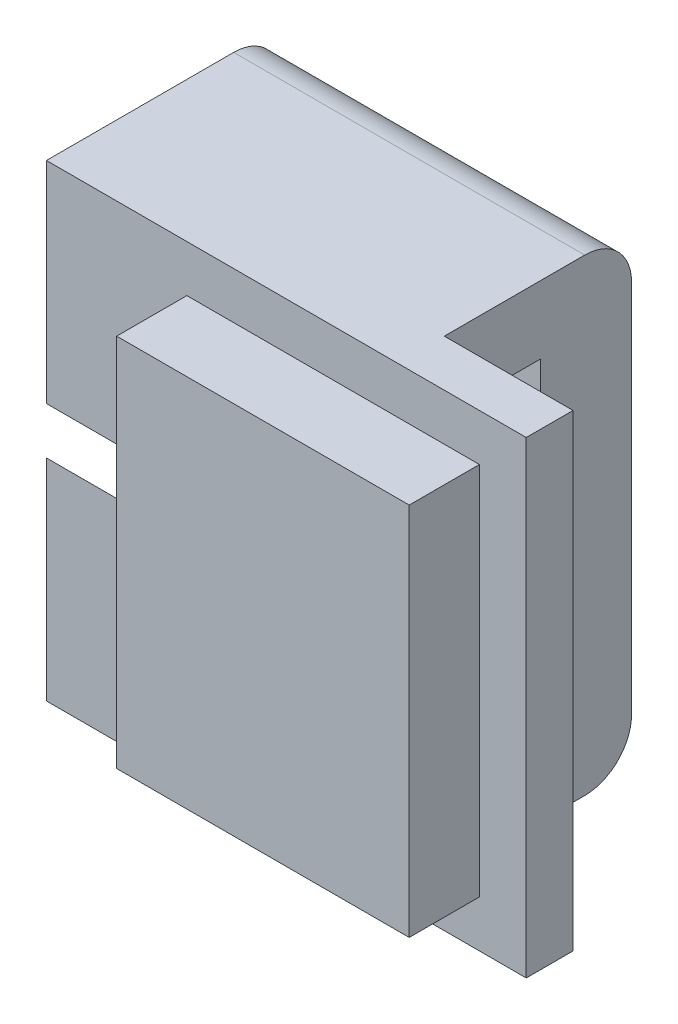
ISO-10303-21;
HEADER;
FILE_DESCRIPTION(('STEP AP214'),'2;1');
FILE_NAME('part.step','',(''),(''),'','','');
FILE_SCHEMA(('AUTOMOTIVE_DESIGN { 1 0 10303 214 1 1 1 1 }'));
ENDSEC;
DATA;
#1=APPLICATION_CONTEXT('core data for automotive mechanical design processes');
#2=APPLICATION_PROTOCOL_DEFINITION('international standard','automotive_design',2000,#1);
#3=PRODUCT_CONTEXT('',#1,'mechanical');
#4=PRODUCT('Part','Part','',(#3));
#5=PRODUCT_RELATED_PRODUCT_CATEGORY('part','',(#4));
#6=PRODUCT_DEFINITION_FORMATION('','',#4);
#7=PRODUCT_DEFINITION_CONTEXT('part definition',#1,'design');
#8=PRODUCT_DEFINITION('design','',#6,#7);
#9=PRODUCT_DEFINITION_SHAPE('','',#8);
#10=(LENGTH_UNIT() NAMED_UNIT(*) SI_UNIT(.MILLI.,.METRE.));
#11=(NAMED_UNIT(*) PLANE_ANGLE_UNIT() SI_UNIT($,.RADIAN.));
#12=(NAMED_UNIT(*) SI_UNIT($,.STERADIAN.) SOLID_ANGLE_UNIT());
#13=UNCERTAINTY_MEASURE_WITH_UNIT(LENGTH_MEASURE(1.E-05),#10,'distance_accuracy_value','');
#14=(GEOMETRIC_REPRESENTATION_CONTEXT(3) GLOBAL_UNCERTAINTY_ASSIGNED_CONTEXT((#13)) GLOBAL_UNIT_ASSIGNED_CONTEXT((#10,
#11,#12)) REPRESENTATION_CONTEXT('',''));
#15=CARTESIAN_POINT('',(0.,0.,0.));
#16=DIRECTION('',(0.,0.,1.));
#17=DIRECTION('',(1.,0.,0.));
#18=AXIS2_PLACEMENT_3D('',#15,#16,#17);
#19=CARTESIAN_POINT('',(20.5,-10.,5.));
#20=DIRECTION('',(0.,0.,-1.));
#21=DIRECTION('',(-1.,0.,0.));
#22=AXIS2_PLACEMENT_3D('',#19,#20,#21);
#23=PLANE('',#22);
#24=DIRECTION('',(-1.,0.,0.));
#25=VECTOR('',#24,1.);
#26=CARTESIAN_POINT('',(9.99999999999998,-1.00498756211208,5.));
#27=LINE('',#26,#25);
#28=CARTESIAN_POINT('',(0.,-1.00498756211208,5.));
#29=VERTEX_POINT('',#28);
#30=CARTESIAN_POINT('',(6.,-1.00498756211208,5.));
#31=VERTEX_POINT('',#30);
#32=EDGE_CURVE('E349',#29,#31,#27,.F.);
#33=ORIENTED_EDGE('',*,*,#32,.F.);
#34=DIRECTION('',(0.,-1.,0.));
#35=VECTOR('',#34,1.);
#36=CARTESIAN_POINT('',(0.,-10.,5.));
#37=LINE('',#36,#35);
#38=CARTESIAN_POINT('',(0.,-10.,5.));
#39=VERTEX_POINT('',#38);
#40=EDGE_CURVE('E403',#29,#39,#37,.T.);
#41=ORIENTED_EDGE('',*,*,#40,.T.);
#42=DIRECTION('',(-1.,0.,0.));
#43=VECTOR('',#42,1.);
#44=CARTESIAN_POINT('',(20.5,-10.,5.));
#45=LINE('',#44,#43);
#46=CARTESIAN_POINT('',(20.5,-10.,5.));
#47=VERTEX_POINT('',#46);
#48=EDGE_CURVE('E400',#47,#39,#45,.T.);
#49=ORIENTED_EDGE('',*,*,#48,.F.);
#50=DIRECTION('',(0.,-1.,0.));
#51=VECTOR('',#50,1.);
#52=CARTESIAN_POINT('',(20.5,-10.,5.));
#53=LINE('',#52,#51);
#54=CARTESIAN_POINT('',(20.5,10.,5.));
#55=VERTEX_POINT('',#54);
#56=EDGE_CURVE('E392',#55,#47,#53,.T.);
#57=ORIENTED_EDGE('',*,*,#56,.F.);
#58=DIRECTION('',(-1.,0.,0.));
#59=VECTOR('',#58,1.);
#60=CARTESIAN_POINT('',(20.5,10.,5.));
#61=LINE('',#60,#59);
#62=CARTESIAN_POINT('',(0.,10.,5.));
#63=VERTEX_POINT('',#62);
#64=EDGE_CURVE('E417',#55,#63,#61,.T.);
#65=ORIENTED_EDGE('',*,*,#64,.T.);
#66=CARTESIAN_POINT('',(0.,1.00498756211208,5.));
#67=VERTEX_POINT('',#66);
#68=EDGE_CURVE('E404',#63,#67,#37,.T.);
#69=ORIENTED_EDGE('',*,*,#68,.T.);
#70=DIRECTION('',(-1.,0.,0.));
#71=VECTOR('',#70,1.);
#72=CARTESIAN_POINT('',(9.99999999999998,1.00498756211208,5.));
#73=LINE('',#72,#71);
#74=CARTESIAN_POINT('',(6.,1.00498756211208,5.));
#75=VERTEX_POINT('',#74);
#76=EDGE_CURVE('E342',#75,#67,#73,.T.);
#77=ORIENTED_EDGE('',*,*,#76,.F.);
#78=DIRECTION('',(0.,-1.,0.));
#79=VECTOR('',#78,1.);
#80=CARTESIAN_POINT('',(6.,-10.,5.));
#81=LINE('',#80,#79);
#82=CARTESIAN_POINT('',(6.,8.,5.));
#83=VERTEX_POINT('',#82);
#84=EDGE_CURVE('E422',#83,#75,#81,.T.);
#85=ORIENTED_EDGE('',*,*,#84,.F.);
#86=DIRECTION('',(-1.,0.,0.));
#87=VECTOR('',#86,1.);
#88=CARTESIAN_POINT('',(20.5,8.00000000000001,5.));
#89=LINE('',#88,#87);
#90=CARTESIAN_POINT('',(18.5,8.00000000000001,5.));
#91=VERTEX_POINT('',#90);
#92=EDGE_CURVE('E426',#91,#83,#89,.T.);
#93=ORIENTED_EDGE('',*,*,#92,.F.);
#94=DIRECTION('',(0.,1.,0.));
#95=VECTOR('',#94,1.);
#96=CARTESIAN_POINT('',(18.5,-10.,5.));
#97=LINE('',#96,#95);
#98=CARTESIAN_POINT('',(18.5,-7.99999999999999,5.));
#99=VERTEX_POINT('',#98);
#100=EDGE_CURVE('E430',#99,#91,#97,.T.);
#101=ORIENTED_EDGE('',*,*,#100,.F.);
#102=DIRECTION('',(1.,0.,0.));
#103=VECTOR('',#102,1.);
#104=CARTESIAN_POINT('',(20.5,-7.99999999999999,5.));
#105=LINE('',#104,#103);
#106=CARTESIAN_POINT('',(6.,-8.,5.));
#107=VERTEX_POINT('',#106);
#108=EDGE_CURVE('E434',#107,#99,#105,.T.);
#109=ORIENTED_EDGE('',*,*,#108,.F.);
#110=EDGE_CURVE('E421',#31,#107,#81,.T.);
#111=ORIENTED_EDGE('',*,*,#110,.F.);
#112=EDGE_LOOP('',(#33,#41,#49,#57,#65,#69,#77,#85,#93,#101,#109,#111));
#113=FACE_BOUND('',#112,.T.);
#114=ADVANCED_FACE('F53',(#113),#23,.F.);
#115=CARTESIAN_POINT('',(20.5,-9.99999999999999,-5.));
#116=DIRECTION('',(0.,0.,1.));
#117=DIRECTION('',(1.,0.,0.));
#118=AXIS2_PLACEMENT_3D('',#115,#116,#117);
#119=PLANE('',#118);
#120=DIRECTION('',(0.,1.,0.));
#121=VECTOR('',#120,1.);
#122=CARTESIAN_POINT('',(0.,-9.99999999999999,-5.));
#123=LINE('',#122,#121);
#124=CARTESIAN_POINT('',(0.,1.00498756211209,-5.));
#125=VERTEX_POINT('',#124);
#126=CARTESIAN_POINT('',(0.,8.,-5.));
#127=VERTEX_POINT('',#126);
#128=EDGE_CURVE('E411',#125,#127,#123,.T.);
#129=ORIENTED_EDGE('',*,*,#128,.T.);
#130=DIRECTION('',(-1.,0.,0.));
#131=VECTOR('',#130,1.);
#132=CARTESIAN_POINT('',(20.5,8.,-5.));
#133=LINE('',#132,#131);
#134=CARTESIAN_POINT('',(15.,8.,-5.));
#135=VERTEX_POINT('',#134);
#136=EDGE_CURVE('E456',#127,#135,#133,.F.);
#137=ORIENTED_EDGE('',*,*,#136,.T.);
#138=DIRECTION('',(0.,1.,0.));
#139=VECTOR('',#138,1.);
#140=CARTESIAN_POINT('',(15.,-9.99999999999999,-5.));
#141=LINE('',#140,#139);
#142=CARTESIAN_POINT('',(15.,-7.99999999999999,-5.));
#143=VERTEX_POINT('',#142);
#144=EDGE_CURVE('E264',#143,#135,#141,.T.);
#145=ORIENTED_EDGE('',*,*,#144,.F.);
#146=DIRECTION('',(-1.,0.,0.));
#147=VECTOR('',#146,1.);
#148=CARTESIAN_POINT('',(20.5,-7.99999999999999,-5.));
#149=LINE('',#148,#147);
#150=CARTESIAN_POINT('',(0.,-7.99999999999999,-5.));
#151=VERTEX_POINT('',#150);
#152=EDGE_CURVE('E452',#143,#151,#149,.T.);
#153=ORIENTED_EDGE('',*,*,#152,.T.);
#154=CARTESIAN_POINT('',(0.,-1.00498756211209,-5.));
#155=VERTEX_POINT('',#154);
#156=EDGE_CURVE('E393',#151,#155,#123,.T.);
#157=ORIENTED_EDGE('',*,*,#156,.T.);
#158=DIRECTION('',(-1.,0.,0.));
#159=VECTOR('',#158,1.);
#160=CARTESIAN_POINT('',(9.99999999999998,-1.00498756211209,-5.));
#161=LINE('',#160,#159);
#162=CARTESIAN_POINT('',(9.99999999999998,-1.00498756211209,-5.));
#163=VERTEX_POINT('',#162);
#164=EDGE_CURVE('E352',#163,#155,#161,.T.);
#165=ORIENTED_EDGE('',*,*,#164,.F.);
#166=DIRECTION('',(0.,1.,0.));
#167=VECTOR('',#166,1.);
#168=CARTESIAN_POINT('',(9.99999999999998,-9.99999999999999,-5.));
#169=LINE('',#168,#167);
#170=CARTESIAN_POINT('',(9.99999999999998,1.00498756211209,-5.));
#171=VERTEX_POINT('',#170);
#172=EDGE_CURVE('E441',#163,#171,#169,.T.);
#173=ORIENTED_EDGE('',*,*,#172,.T.);
#174=DIRECTION('',(-1.,0.,0.));
#175=VECTOR('',#174,1.);
#176=CARTESIAN_POINT('',(9.99999999999998,1.00498756211209,-5.));
#177=LINE('',#176,#175);
#178=EDGE_CURVE('E356',#125,#171,#177,.F.);
#179=ORIENTED_EDGE('',*,*,#178,.F.);
#180=EDGE_LOOP('',(#129,#137,#145,#153,#157,#165,#173,#179));
#181=FACE_BOUND('',#180,.T.);
#182=ADVANCED_FACE('F498',(#181),#119,.F.);
#183=CARTESIAN_POINT('',(0.,0.,0.));
#184=DIRECTION('',(1.,0.,0.));
#185=DIRECTION('',(0.,0.,-1.));
#186=AXIS2_PLACEMENT_3D('',#183,#184,#185);
#187=PLANE('',#186);
#188=ORIENTED_EDGE('',*,*,#156,.F.);
#189=CARTESIAN_POINT('',(0.,-7.99999999999999,-3.));
#190=DIRECTION('',(1.,0.,0.));
#191=DIRECTION('',(0.,0.,-1.));
#192=AXIS2_PLACEMENT_3D('',#189,#190,#191);
#193=CIRCLE('',#192,2.);
#194=CARTESIAN_POINT('',(0.,-9.99999999999999,-3.));
#195=VERTEX_POINT('',#194);
#196=EDGE_CURVE('E62',#151,#195,#193,.F.);
#197=ORIENTED_EDGE('',*,*,#196,.T.);
#198=DIRECTION('',(0.,0.,-1.));
#199=VECTOR('',#198,1.);
#200=CARTESIAN_POINT('',(0.,-10.,5.));
#201=LINE('',#200,#199);
#202=EDGE_CURVE('E408',#39,#195,#201,.T.);
#203=ORIENTED_EDGE('',*,*,#202,.F.);
#204=ORIENTED_EDGE('',*,*,#40,.F.);
#205=CARTESIAN_POINT('',(0.,0.,0.));
#206=DIRECTION('',(1.,0.,0.));
#207=DIRECTION('',(0.,0.,-1.));
#208=AXIS2_PLACEMENT_3D('',#205,#206,#207);
#209=CIRCLE('',#208,5.1);
#210=EDGE_CURVE('E335',#29,#155,#209,.T.);
#211=ORIENTED_EDGE('',*,*,#210,.T.);
#212=EDGE_LOOP('',(#188,#197,#203,#204,#211));
#213=FACE_BOUND('',#212,.T.);
#214=ADVANCED_FACE('F472',(#213),#187,.F.);
#215=CARTESIAN_POINT('',(20.5,10.,5.));
#216=DIRECTION('',(0.,-1.,0.));
#217=DIRECTION('',(0.,0.,-1.));
#218=AXIS2_PLACEMENT_3D('',#215,#216,#217);
#219=PLANE('',#218);
#220=DIRECTION('',(0.,0.,-1.));
#221=VECTOR('',#220,1.);
#222=CARTESIAN_POINT('',(15.,10.,3.));
#223=LINE('',#222,#221);
#224=CARTESIAN_POINT('',(15.,10.,3.));
#225=VERTEX_POINT('',#224);
#226=CARTESIAN_POINT('',(15.,10.,-3.));
#227=VERTEX_POINT('',#226);
#228=EDGE_CURVE('E331',#225,#227,#223,.T.);
#229=ORIENTED_EDGE('',*,*,#228,.T.);
#230=DIRECTION('',(-1.,0.,0.));
#231=VECTOR('',#230,1.);
#232=CARTESIAN_POINT('',(20.5,10.,-3.));
#233=LINE('',#232,#231);
#234=CARTESIAN_POINT('',(0.,10.,-3.));
#235=VERTEX_POINT('',#234);
#236=EDGE_CURVE('E445',#227,#235,#233,.T.);
#237=ORIENTED_EDGE('',*,*,#236,.T.);
#238=DIRECTION('',(0.,0.,1.));
#239=VECTOR('',#238,1.);
#240=CARTESIAN_POINT('',(0.,10.,5.));
#241=LINE('',#240,#239);
#242=EDGE_CURVE('E388',#235,#63,#241,.T.);
#243=ORIENTED_EDGE('',*,*,#242,.T.);
#244=ORIENTED_EDGE('',*,*,#64,.F.);
#245=DIRECTION('',(0.,0.,1.));
#246=VECTOR('',#245,1.);
#247=CARTESIAN_POINT('',(20.5,10.,5.));
#248=LINE('',#247,#246);
#249=CARTESIAN_POINT('',(20.5,10.,3.));
#250=VERTEX_POINT('',#249);
#251=EDGE_CURVE('E389',#250,#55,#248,.T.);
#252=ORIENTED_EDGE('',*,*,#251,.F.);
#253=DIRECTION('',(1.,0.,0.));
#254=VECTOR('',#253,1.);
#255=CARTESIAN_POINT('',(20.5,10.,3.));
#256=LINE('',#255,#254);
#257=EDGE_CURVE('E324',#225,#250,#256,.T.);
#258=ORIENTED_EDGE('',*,*,#257,.F.);
#259=EDGE_LOOP('',(#229,#237,#243,#244,#252,#258));
#260=FACE_BOUND('',#259,.T.);
#261=ADVANCED_FACE('F524',(#260),#219,.F.);
#262=CARTESIAN_POINT('',(20.5,-10.,5.));
#263=DIRECTION('',(0.,1.,0.));
#264=DIRECTION('',(0.,0.,1.));
#265=AXIS2_PLACEMENT_3D('',#262,#263,#264);
#266=PLANE('',#265);
#267=ORIENTED_EDGE('',*,*,#202,.T.);
#268=DIRECTION('',(-1.,0.,0.));
#269=VECTOR('',#268,1.);
#270=CARTESIAN_POINT('',(20.5,-9.99999999999999,-3.));
#271=LINE('',#270,#269);
#272=CARTESIAN_POINT('',(15.,-9.99999999999999,-3.));
#273=VERTEX_POINT('',#272);
#274=EDGE_CURVE('E11',#195,#273,#271,.F.);
#275=ORIENTED_EDGE('',*,*,#274,.T.);
#276=DIRECTION('',(0.,0.,-1.));
#277=VECTOR('',#276,1.);
#278=CARTESIAN_POINT('',(15.,-9.99999999999999,3.));
#279=LINE('',#278,#277);
#280=CARTESIAN_POINT('',(15.,-9.99999999999999,3.));
#281=VERTEX_POINT('',#280);
#282=EDGE_CURVE('E327',#281,#273,#279,.T.);
#283=ORIENTED_EDGE('',*,*,#282,.F.);
#284=DIRECTION('',(-1.,0.,0.));
#285=VECTOR('',#284,1.);
#286=CARTESIAN_POINT('',(20.5,-9.99999999999999,3.));
#287=LINE('',#286,#285);
#288=CARTESIAN_POINT('',(20.5,-9.99999999999999,3.));
#289=VERTEX_POINT('',#288);
#290=EDGE_CURVE('E316',#289,#281,#287,.T.);
#291=ORIENTED_EDGE('',*,*,#290,.F.);
#292=DIRECTION('',(0.,0.,-1.));
#293=VECTOR('',#292,1.);
#294=CARTESIAN_POINT('',(20.5,-10.,5.));
#295=LINE('',#294,#293);
#296=EDGE_CURVE('E396',#47,#289,#295,.T.);
#297=ORIENTED_EDGE('',*,*,#296,.F.);
#298=ORIENTED_EDGE('',*,*,#48,.T.);
#299=EDGE_LOOP('',(#267,#275,#283,#291,#297,#298));
#300=FACE_BOUND('',#299,.T.);
#301=ADVANCED_FACE('F523',(#300),#266,.F.);
#302=CARTESIAN_POINT('',(20.5,0.,0.));
#303=DIRECTION('',(1.,0.,0.));
#304=DIRECTION('',(0.,0.,-1.));
#305=AXIS2_PLACEMENT_3D('',#302,#303,#304);
#306=PLANE('',#305);
#307=DIRECTION('',(0.,-1.,0.));
#308=VECTOR('',#307,1.);
#309=CARTESIAN_POINT('',(20.5,-9.99999999999999,3.));
#310=LINE('',#309,#308);
#311=EDGE_CURVE('E313',#250,#289,#310,.T.);
#312=ORIENTED_EDGE('',*,*,#311,.F.);
#313=ORIENTED_EDGE('',*,*,#251,.T.);
#314=ORIENTED_EDGE('',*,*,#56,.T.);
#315=ORIENTED_EDGE('',*,*,#296,.T.);
#316=EDGE_LOOP('',(#312,#313,#314,#315));
#317=FACE_BOUND('',#316,.T.);
#318=ADVANCED_FACE('F548',(#317),#306,.T.);
#319=ORIENTED_EDGE('',*,*,#242,.F.);
#320=CARTESIAN_POINT('',(0.,8.,-3.));
#321=DIRECTION('',(1.,0.,0.));
#322=DIRECTION('',(0.,0.,-1.));
#323=AXIS2_PLACEMENT_3D('',#320,#321,#322);
#324=CIRCLE('',#323,2.);
#325=EDGE_CURVE('E449',#235,#127,#324,.F.);
#326=ORIENTED_EDGE('',*,*,#325,.T.);
#327=ORIENTED_EDGE('',*,*,#128,.F.);
#328=EDGE_CURVE('E343',#125,#67,#209,.T.);
#329=ORIENTED_EDGE('',*,*,#328,.T.);
#330=ORIENTED_EDGE('',*,*,#68,.F.);
#331=EDGE_LOOP('',(#319,#326,#327,#329,#330));
#332=FACE_BOUND('',#331,.T.);
#333=ADVANCED_FACE('F493',(#332),#187,.F.);
#334=CARTESIAN_POINT('',(6.,-8.,7.99999999999998));
#335=DIRECTION('',(0.,1.,0.));
#336=DIRECTION('',(-1.,0.,0.));
#337=AXIS2_PLACEMENT_3D('',#334,#335,#336);
#338=PLANE('',#337);
#339=DIRECTION('',(0.,0.,-1.));
#340=VECTOR('',#339,1.);
#341=CARTESIAN_POINT('',(6.,-8.,7.99999999999998));
#342=LINE('',#341,#340);
#343=CARTESIAN_POINT('',(6.,-8.,7.99999999999998));
#344=VERTEX_POINT('',#343);
#345=EDGE_CURVE('E372',#344,#107,#342,.T.);
#346=ORIENTED_EDGE('',*,*,#345,.T.);
#347=ORIENTED_EDGE('',*,*,#108,.T.);
#348=DIRECTION('',(0.,0.,-1.));
#349=VECTOR('',#348,1.);
#350=CARTESIAN_POINT('',(18.5,-7.99999999999999,7.99999999999998));
#351=LINE('',#350,#349);
#352=CARTESIAN_POINT('',(18.5,-7.99999999999999,7.99999999999998));
#353=VERTEX_POINT('',#352);
#354=EDGE_CURVE('E384',#353,#99,#351,.T.);
#355=ORIENTED_EDGE('',*,*,#354,.F.);
#356=DIRECTION('',(1.,0.,0.));
#357=VECTOR('',#356,1.);
#358=CARTESIAN_POINT('',(6.,-8.,7.99999999999998));
#359=LINE('',#358,#357);
#360=EDGE_CURVE('E359',#344,#353,#359,.T.);
#361=ORIENTED_EDGE('',*,*,#360,.F.);
#362=EDGE_LOOP('',(#346,#347,#355,#361));
#363=FACE_BOUND('',#362,.T.);
#364=ADVANCED_FACE('F558',(#363),#338,.F.);
#365=CARTESIAN_POINT('',(18.5,-7.99999999999999,7.99999999999998));
#366=DIRECTION('',(-1.,0.,0.));
#367=DIRECTION('',(0.,0.,1.));
#368=AXIS2_PLACEMENT_3D('',#365,#366,#367);
#369=PLANE('',#368);
#370=ORIENTED_EDGE('',*,*,#354,.T.);
#371=ORIENTED_EDGE('',*,*,#100,.T.);
#372=DIRECTION('',(0.,0.,-1.));
#373=VECTOR('',#372,1.);
#374=CARTESIAN_POINT('',(18.5,8.,7.99999999999998));
#375=LINE('',#374,#373);
#376=CARTESIAN_POINT('',(18.5,8.,7.99999999999998));
#377=VERTEX_POINT('',#376);
#378=EDGE_CURVE('E380',#377,#91,#375,.T.);
#379=ORIENTED_EDGE('',*,*,#378,.F.);
#380=DIRECTION('',(0.,1.,0.));
#381=VECTOR('',#380,1.);
#382=CARTESIAN_POINT('',(18.5,-7.99999999999999,7.99999999999998));
#383=LINE('',#382,#381);
#384=EDGE_CURVE('E363',#353,#377,#383,.T.);
#385=ORIENTED_EDGE('',*,*,#384,.F.);
#386=EDGE_LOOP('',(#370,#371,#379,#385));
#387=FACE_BOUND('',#386,.T.);
#388=ADVANCED_FACE('F563',(#387),#369,.F.);
#389=CARTESIAN_POINT('',(6.,8.,7.99999999999998));
#390=DIRECTION('',(0.,-1.,0.));
#391=DIRECTION('',(1.,0.,0.));
#392=AXIS2_PLACEMENT_3D('',#389,#390,#391);
#393=PLANE('',#392);
#394=ORIENTED_EDGE('',*,*,#378,.T.);
#395=ORIENTED_EDGE('',*,*,#92,.T.);
#396=DIRECTION('',(0.,0.,-1.));
#397=VECTOR('',#396,1.);
#398=CARTESIAN_POINT('',(6.,8.,7.99999999999998));
#399=LINE('',#398,#397);
#400=CARTESIAN_POINT('',(6.,8.,7.99999999999998));
#401=VERTEX_POINT('',#400);
#402=EDGE_CURVE('E376',#401,#83,#399,.T.);
#403=ORIENTED_EDGE('',*,*,#402,.F.);
#404=DIRECTION('',(-1.,0.,0.));
#405=VECTOR('',#404,1.);
#406=CARTESIAN_POINT('',(6.,8.,7.99999999999998));
#407=LINE('',#406,#405);
#408=EDGE_CURVE('E366',#377,#401,#407,.T.);
#409=ORIENTED_EDGE('',*,*,#408,.F.);
#410=EDGE_LOOP('',(#394,#395,#403,#409));
#411=FACE_BOUND('',#410,.T.);
#412=ADVANCED_FACE('F567',(#411),#393,.F.);
#413=CARTESIAN_POINT('',(6.,-8.,7.99999999999998));
#414=DIRECTION('',(1.,0.,0.));
#415=DIRECTION('',(0.,0.,-1.));
#416=AXIS2_PLACEMENT_3D('',#413,#414,#415);
#417=PLANE('',#416);
#418=CARTESIAN_POINT('',(6.,0.,0.));
#419=DIRECTION('',(1.,0.,0.));
#420=DIRECTION('',(0.,0.,-1.));
#421=AXIS2_PLACEMENT_3D('',#418,#419,#420);
#422=CIRCLE('',#421,5.1);
#423=EDGE_CURVE('E438',#31,#75,#422,.F.);
#424=ORIENTED_EDGE('',*,*,#423,.F.);
#425=ORIENTED_EDGE('',*,*,#110,.T.);
#426=ORIENTED_EDGE('',*,*,#345,.F.);
#427=DIRECTION('',(0.,-1.,0.));
#428=VECTOR('',#427,1.);
#429=CARTESIAN_POINT('',(6.,-8.,7.99999999999998));
#430=LINE('',#429,#428);
#431=EDGE_CURVE('E369',#401,#344,#430,.T.);
#432=ORIENTED_EDGE('',*,*,#431,.F.);
#433=ORIENTED_EDGE('',*,*,#402,.T.);
#434=ORIENTED_EDGE('',*,*,#84,.T.);
#435=EDGE_LOOP('',(#424,#425,#426,#432,#433,#434));
#436=FACE_BOUND('',#435,.T.);
#437=ADVANCED_FACE('F484',(#436),#417,.F.);
#438=CARTESIAN_POINT('',(0.,0.,7.99999999999998));
#439=DIRECTION('',(0.,0.,1.));
#440=DIRECTION('',(1.,0.,0.));
#441=AXIS2_PLACEMENT_3D('',#438,#439,#440);
#442=PLANE('',#441);
#443=ORIENTED_EDGE('',*,*,#360,.T.);
#444=ORIENTED_EDGE('',*,*,#384,.T.);
#445=ORIENTED_EDGE('',*,*,#408,.T.);
#446=ORIENTED_EDGE('',*,*,#431,.T.);
#447=EDGE_LOOP('',(#443,#444,#445,#446));
#448=FACE_BOUND('',#447,.T.);
#449=ADVANCED_FACE('F503',(#448),#442,.T.);
#450=CARTESIAN_POINT('',(9.99999999999998,0.,0.));
#451=DIRECTION('',(1.,0.,0.));
#452=DIRECTION('',(0.,0.,-1.));
#453=AXIS2_PLACEMENT_3D('',#450,#451,#452);
#454=PLANE('',#453);
#455=CARTESIAN_POINT('',(9.99999999999998,0.,0.));
#456=DIRECTION('',(1.,0.,0.));
#457=DIRECTION('',(0.,0.,-1.));
#458=AXIS2_PLACEMENT_3D('',#455,#456,#457);
#459=CIRCLE('',#458,5.1);
#460=EDGE_CURVE('E338',#171,#163,#459,.T.);
#461=ORIENTED_EDGE('',*,*,#460,.F.);
#462=ORIENTED_EDGE('',*,*,#172,.F.);
#463=EDGE_LOOP('',(#461,#462));
#464=FACE_BOUND('',#463,.T.);
#465=ADVANCED_FACE('F501',(#464),#454,.F.);
#466=CARTESIAN_POINT('',(9.99999999999998,0.,0.));
#467=DIRECTION('',(-1.,0.,0.));
#468=DIRECTION('',(0.,0.,1.));
#469=AXIS2_PLACEMENT_3D('',#466,#467,#468);
#470=CYLINDRICAL_SURFACE('',#469,5.1);
#471=ORIENTED_EDGE('',*,*,#178,.T.);
#472=ORIENTED_EDGE('',*,*,#460,.T.);
#473=ORIENTED_EDGE('',*,*,#164,.T.);
#474=ORIENTED_EDGE('',*,*,#210,.F.);
#475=ORIENTED_EDGE('',*,*,#32,.T.);
#476=ORIENTED_EDGE('',*,*,#423,.T.);
#477=ORIENTED_EDGE('',*,*,#76,.T.);
#478=ORIENTED_EDGE('',*,*,#328,.F.);
#479=EDGE_LOOP('',(#471,#472,#473,#474,#475,#476,#477,#478));
#480=FACE_BOUND('',#479,.T.);
#481=ADVANCED_FACE('F475',(#480),#470,.F.);
#482=CARTESIAN_POINT('',(15.,-9.99999999999999,3.));
#483=DIRECTION('',(-1.,0.,0.));
#484=DIRECTION('',(0.,-1.,0.));
#485=AXIS2_PLACEMENT_3D('',#482,#483,#484);
#486=PLANE('',#485);
#487=DIRECTION('',(0.,-1.,0.));
#488=VECTOR('',#487,1.);
#489=CARTESIAN_POINT('',(15.,4.9,1.1));
#490=LINE('',#489,#488);
#491=CARTESIAN_POINT('',(15.,7.1,1.1));
#492=VERTEX_POINT('',#491);
#493=CARTESIAN_POINT('',(15.,4.9,1.1));
#494=VERTEX_POINT('',#493);
#495=EDGE_CURVE('E254',#492,#494,#490,.T.);
#496=ORIENTED_EDGE('',*,*,#495,.F.);
#497=DIRECTION('',(0.,0.,1.));
#498=VECTOR('',#497,1.);
#499=CARTESIAN_POINT('',(15.,7.1,1.1));
#500=LINE('',#499,#498);
#501=CARTESIAN_POINT('',(15.,7.1,-1.1));
#502=VERTEX_POINT('',#501);
#503=EDGE_CURVE('E221',#502,#492,#500,.T.);
#504=ORIENTED_EDGE('',*,*,#503,.F.);
#505=DIRECTION('',(0.,1.,0.));
#506=VECTOR('',#505,1.);
#507=CARTESIAN_POINT('',(15.,4.9,-1.1));
#508=LINE('',#507,#506);
#509=CARTESIAN_POINT('',(15.,4.9,-1.1));
#510=VERTEX_POINT('',#509);
#511=EDGE_CURVE('E241',#510,#502,#508,.T.);
#512=ORIENTED_EDGE('',*,*,#511,.F.);
#513=DIRECTION('',(0.,0.,-1.));
#514=VECTOR('',#513,1.);
#515=CARTESIAN_POINT('',(15.,4.9,1.1));
#516=LINE('',#515,#514);
#517=EDGE_CURVE('E245',#494,#510,#516,.T.);
#518=ORIENTED_EDGE('',*,*,#517,.F.);
#519=EDGE_LOOP('',(#496,#504,#512,#518));
#520=FACE_BOUND('',#519,.T.);
#521=DIRECTION('',(0.,-1.,0.));
#522=VECTOR('',#521,1.);
#523=CARTESIAN_POINT('',(15.,-4.9,1.1));
#524=LINE('',#523,#522);
#525=CARTESIAN_POINT('',(15.,-4.9,1.1));
#526=VERTEX_POINT('',#525);
#527=CARTESIAN_POINT('',(15.,-7.1,1.1));
#528=VERTEX_POINT('',#527);
#529=EDGE_CURVE('E293',#526,#528,#524,.T.);
#530=ORIENTED_EDGE('',*,*,#529,.F.);
#531=DIRECTION('',(0.,0.,1.));
#532=VECTOR('',#531,1.);
#533=CARTESIAN_POINT('',(15.,-4.9,1.1));
#534=LINE('',#533,#532);
#535=CARTESIAN_POINT('',(15.,-4.9,-1.1));
#536=VERTEX_POINT('',#535);
#537=EDGE_CURVE('E255',#536,#526,#534,.T.);
#538=ORIENTED_EDGE('',*,*,#537,.F.);
#539=DIRECTION('',(0.,1.,0.));
#540=VECTOR('',#539,1.);
#541=CARTESIAN_POINT('',(15.,-4.9,-1.1));
#542=LINE('',#541,#540);
#543=CARTESIAN_POINT('',(15.,-7.1,-1.1));
#544=VERTEX_POINT('',#543);
#545=EDGE_CURVE('E284',#544,#536,#542,.T.);
#546=ORIENTED_EDGE('',*,*,#545,.F.);
#547=DIRECTION('',(0.,0.,-1.));
#548=VECTOR('',#547,1.);
#549=CARTESIAN_POINT('',(15.,-7.1,1.1));
#550=LINE('',#549,#548);
#551=EDGE_CURVE('E288',#528,#544,#550,.T.);
#552=ORIENTED_EDGE('',*,*,#551,.F.);
#553=EDGE_LOOP('',(#530,#538,#546,#552));
#554=FACE_BOUND('',#553,.T.);
#555=ORIENTED_EDGE('',*,*,#144,.T.);
#556=CARTESIAN_POINT('',(15.,8.,-3.));
#557=DIRECTION('',(-1.,0.,0.));
#558=DIRECTION('',(0.,-1.,0.));
#559=AXIS2_PLACEMENT_3D('',#556,#557,#558);
#560=CIRCLE('',#559,2.);
#561=EDGE_CURVE('E462',#135,#227,#560,.F.);
#562=ORIENTED_EDGE('',*,*,#561,.T.);
#563=ORIENTED_EDGE('',*,*,#228,.F.);
#564=DIRECTION('',(0.,1.,0.));
#565=VECTOR('',#564,1.);
#566=CARTESIAN_POINT('',(15.,-9.99999999999999,3.));
#567=LINE('',#566,#565);
#568=EDGE_CURVE('E320',#281,#225,#567,.T.);
#569=ORIENTED_EDGE('',*,*,#568,.F.);
#570=ORIENTED_EDGE('',*,*,#282,.T.);
#571=CARTESIAN_POINT('',(15.,-7.99999999999999,-3.));
#572=DIRECTION('',(-1.,0.,0.));
#573=DIRECTION('',(0.,-1.,0.));
#574=AXIS2_PLACEMENT_3D('',#571,#572,#573);
#575=CIRCLE('',#574,2.);
#576=EDGE_CURVE('E459',#273,#143,#575,.F.);
#577=ORIENTED_EDGE('',*,*,#576,.T.);
#578=EDGE_LOOP('',(#555,#562,#563,#569,#570,#577));
#579=FACE_BOUND('',#578,.T.);
#580=ADVANCED_FACE('F509',(#520,#554,#579),#486,.F.);
#581=CARTESIAN_POINT('',(0.,0.,3.));
#582=DIRECTION('',(0.,0.,1.));
#583=DIRECTION('',(1.,0.,0.));
#584=AXIS2_PLACEMENT_3D('',#581,#582,#583);
#585=PLANE('',#584);
#586=ORIENTED_EDGE('',*,*,#311,.T.);
#587=ORIENTED_EDGE('',*,*,#290,.T.);
#588=ORIENTED_EDGE('',*,*,#568,.T.);
#589=ORIENTED_EDGE('',*,*,#257,.T.);
#590=EDGE_LOOP('',(#586,#587,#588,#589));
#591=FACE_BOUND('',#590,.T.);
#592=ADVANCED_FACE('F545',(#591),#585,.F.);
#593=CARTESIAN_POINT('',(12.,-4.9,1.1));
#594=DIRECTION('',(0.,1.,0.));
#595=DIRECTION('',(-1.,0.,0.));
#596=AXIS2_PLACEMENT_3D('',#593,#594,#595);
#597=PLANE('',#596);
#598=ORIENTED_EDGE('',*,*,#537,.T.);
#599=DIRECTION('',(1.,0.,0.));
#600=VECTOR('',#599,1.);
#601=CARTESIAN_POINT('',(12.,-4.9,1.1));
#602=LINE('',#601,#600);
#603=CARTESIAN_POINT('',(12.,-4.9,1.1));
#604=VERTEX_POINT('',#603);
#605=EDGE_CURVE('E270',#604,#526,#602,.T.);
#606=ORIENTED_EDGE('',*,*,#605,.F.);
#607=DIRECTION('',(0.,0.,1.));
#608=VECTOR('',#607,1.);
#609=CARTESIAN_POINT('',(12.,-4.9,1.1));
#610=LINE('',#609,#608);
#611=CARTESIAN_POINT('',(12.,-4.9,-1.1));
#612=VERTEX_POINT('',#611);
#613=EDGE_CURVE('E289',#612,#604,#610,.T.);
#614=ORIENTED_EDGE('',*,*,#613,.F.);
#615=DIRECTION('',(1.,0.,0.));
#616=VECTOR('',#615,1.);
#617=CARTESIAN_POINT('',(12.,-4.9,-1.1));
#618=LINE('',#617,#616);
#619=EDGE_CURVE('E281',#612,#536,#618,.T.);
#620=ORIENTED_EDGE('',*,*,#619,.T.);
#621=EDGE_LOOP('',(#598,#606,#614,#620));
#622=FACE_BOUND('',#621,.T.);
#623=ADVANCED_FACE('F712',(#622),#597,.F.);
#624=CARTESIAN_POINT('',(12.,-4.9,-1.1));
#625=DIRECTION('',(0.,0.,-1.));
#626=DIRECTION('',(-1.,0.,0.));
#627=AXIS2_PLACEMENT_3D('',#624,#625,#626);
#628=PLANE('',#627);
#629=ORIENTED_EDGE('',*,*,#545,.T.);
#630=ORIENTED_EDGE('',*,*,#619,.F.);
#631=DIRECTION('',(0.,1.,0.));
#632=VECTOR('',#631,1.);
#633=CARTESIAN_POINT('',(12.,-4.9,-1.1));
#634=LINE('',#633,#632);
#635=CARTESIAN_POINT('',(12.,-7.1,-1.1));
#636=VERTEX_POINT('',#635);
#637=EDGE_CURVE('E274',#636,#612,#634,.T.);
#638=ORIENTED_EDGE('',*,*,#637,.F.);
#639=DIRECTION('',(1.,0.,0.));
#640=VECTOR('',#639,1.);
#641=CARTESIAN_POINT('',(12.,-7.1,-1.1));
#642=LINE('',#641,#640);
#643=EDGE_CURVE('E278',#636,#544,#642,.T.);
#644=ORIENTED_EDGE('',*,*,#643,.T.);
#645=EDGE_LOOP('',(#629,#630,#638,#644));
#646=FACE_BOUND('',#645,.T.);
#647=ADVANCED_FACE('F703',(#646),#628,.F.);
#648=CARTESIAN_POINT('',(12.,-7.1,1.1));
#649=DIRECTION('',(0.,-1.,0.));
#650=DIRECTION('',(1.,0.,0.));
#651=AXIS2_PLACEMENT_3D('',#648,#649,#650);
#652=PLANE('',#651);
#653=ORIENTED_EDGE('',*,*,#551,.T.);
#654=ORIENTED_EDGE('',*,*,#643,.F.);
#655=DIRECTION('',(0.,0.,-1.));
#656=VECTOR('',#655,1.);
#657=CARTESIAN_POINT('',(12.,-7.1,1.1));
#658=LINE('',#657,#656);
#659=CARTESIAN_POINT('',(12.,-7.1,1.1));
#660=VERTEX_POINT('',#659);
#661=EDGE_CURVE('E302',#660,#636,#658,.T.);
#662=ORIENTED_EDGE('',*,*,#661,.F.);
#663=DIRECTION('',(1.,0.,0.));
#664=VECTOR('',#663,1.);
#665=CARTESIAN_POINT('',(12.,-7.1,1.1));
#666=LINE('',#665,#664);
#667=EDGE_CURVE('E275',#660,#528,#666,.T.);
#668=ORIENTED_EDGE('',*,*,#667,.T.);
#669=EDGE_LOOP('',(#653,#654,#662,#668));
#670=FACE_BOUND('',#669,.T.);
#671=ADVANCED_FACE('F694',(#670),#652,.F.);
#672=CARTESIAN_POINT('',(12.,-4.9,1.1));
#673=DIRECTION('',(0.,0.,1.));
#674=DIRECTION('',(1.,0.,0.));
#675=AXIS2_PLACEMENT_3D('',#672,#673,#674);
#676=PLANE('',#675);
#677=ORIENTED_EDGE('',*,*,#529,.T.);
#678=ORIENTED_EDGE('',*,*,#667,.F.);
#679=DIRECTION('',(0.,-1.,0.));
#680=VECTOR('',#679,1.);
#681=CARTESIAN_POINT('',(12.,-4.9,1.1));
#682=LINE('',#681,#680);
#683=EDGE_CURVE('E306',#604,#660,#682,.T.);
#684=ORIENTED_EDGE('',*,*,#683,.F.);
#685=ORIENTED_EDGE('',*,*,#605,.T.);
#686=EDGE_LOOP('',(#677,#678,#684,#685));
#687=FACE_BOUND('',#686,.T.);
#688=ADVANCED_FACE('F685',(#687),#676,.F.);
#689=CARTESIAN_POINT('',(12.,0.,0.));
#690=DIRECTION('',(-1.,0.,0.));
#691=DIRECTION('',(0.,-1.,0.));
#692=AXIS2_PLACEMENT_3D('',#689,#690,#691);
#693=PLANE('',#692);
#694=ORIENTED_EDGE('',*,*,#613,.T.);
#695=ORIENTED_EDGE('',*,*,#683,.T.);
#696=ORIENTED_EDGE('',*,*,#661,.T.);
#697=ORIENTED_EDGE('',*,*,#637,.T.);
#698=EDGE_LOOP('',(#694,#695,#696,#697));
#699=FACE_BOUND('',#698,.T.);
#700=ADVANCED_FACE('F677',(#699),#693,.F.);
#701=CARTESIAN_POINT('',(12.,7.1,1.1));
#702=DIRECTION('',(0.,1.,0.));
#703=DIRECTION('',(-1.,0.,0.));
#704=AXIS2_PLACEMENT_3D('',#701,#702,#703);
#705=PLANE('',#704);
#706=ORIENTED_EDGE('',*,*,#503,.T.);
#707=DIRECTION('',(1.,0.,0.));
#708=VECTOR('',#707,1.);
#709=CARTESIAN_POINT('',(12.,7.1,1.1));
#710=LINE('',#709,#708);
#711=CARTESIAN_POINT('',(12.,7.1,1.1));
#712=VERTEX_POINT('',#711);
#713=EDGE_CURVE('E214',#712,#492,#710,.T.);
#714=ORIENTED_EDGE('',*,*,#713,.F.);
#715=DIRECTION('',(0.,0.,1.));
#716=VECTOR('',#715,1.);
#717=CARTESIAN_POINT('',(12.,7.1,1.1));
#718=LINE('',#717,#716);
#719=CARTESIAN_POINT('',(12.,7.1,-1.1));
#720=VERTEX_POINT('',#719);
#721=EDGE_CURVE('E218',#720,#712,#718,.T.);
#722=ORIENTED_EDGE('',*,*,#721,.F.);
#723=DIRECTION('',(1.,0.,0.));
#724=VECTOR('',#723,1.);
#725=CARTESIAN_POINT('',(12.,7.1,-1.1));
#726=LINE('',#725,#724);
#727=EDGE_CURVE('E261',#720,#502,#726,.T.);
#728=ORIENTED_EDGE('',*,*,#727,.T.);
#729=EDGE_LOOP('',(#706,#714,#722,#728));
#730=FACE_BOUND('',#729,.T.);
#731=ADVANCED_FACE('F216',(#730),#705,.F.);
#732=CARTESIAN_POINT('',(12.,4.9,-1.1));
#733=DIRECTION('',(0.,0.,-1.));
#734=DIRECTION('',(-1.,0.,0.));
#735=AXIS2_PLACEMENT_3D('',#732,#733,#734);
#736=PLANE('',#735);
#737=ORIENTED_EDGE('',*,*,#511,.T.);
#738=ORIENTED_EDGE('',*,*,#727,.F.);
#739=DIRECTION('',(0.,1.,0.));
#740=VECTOR('',#739,1.);
#741=CARTESIAN_POINT('',(12.,4.9,-1.1));
#742=LINE('',#741,#740);
#743=CARTESIAN_POINT('',(12.,4.9,-1.1));
#744=VERTEX_POINT('',#743);
#745=EDGE_CURVE('E227',#744,#720,#742,.T.);
#746=ORIENTED_EDGE('',*,*,#745,.F.);
#747=DIRECTION('',(1.,0.,0.));
#748=VECTOR('',#747,1.);
#749=CARTESIAN_POINT('',(12.,4.9,-1.1));
#750=LINE('',#749,#748);
#751=EDGE_CURVE('E265',#744,#510,#750,.T.);
#752=ORIENTED_EDGE('',*,*,#751,.T.);
#753=EDGE_LOOP('',(#737,#738,#746,#752));
#754=FACE_BOUND('',#753,.T.);
#755=ADVANCED_FACE('F660',(#754),#736,.F.);
#756=CARTESIAN_POINT('',(12.,4.9,1.1));
#757=DIRECTION('',(0.,-1.,0.));
#758=DIRECTION('',(1.,0.,0.));
#759=AXIS2_PLACEMENT_3D('',#756,#757,#758);
#760=PLANE('',#759);
#761=ORIENTED_EDGE('',*,*,#517,.T.);
#762=ORIENTED_EDGE('',*,*,#751,.F.);
#763=DIRECTION('',(0.,0.,-1.));
#764=VECTOR('',#763,1.);
#765=CARTESIAN_POINT('',(12.,4.9,1.1));
#766=LINE('',#765,#764);
#767=CARTESIAN_POINT('',(12.,4.9,1.1));
#768=VERTEX_POINT('',#767);
#769=EDGE_CURVE('E236',#768,#744,#766,.T.);
#770=ORIENTED_EDGE('',*,*,#769,.F.);
#771=DIRECTION('',(1.,0.,0.));
#772=VECTOR('',#771,1.);
#773=CARTESIAN_POINT('',(12.,4.9,1.1));
#774=LINE('',#773,#772);
#775=EDGE_CURVE('E226',#768,#494,#774,.T.);
#776=ORIENTED_EDGE('',*,*,#775,.T.);
#777=EDGE_LOOP('',(#761,#762,#770,#776));
#778=FACE_BOUND('',#777,.T.);
#779=ADVANCED_FACE('F652',(#778),#760,.F.);
#780=CARTESIAN_POINT('',(12.,4.9,1.1));
#781=DIRECTION('',(0.,0.,1.));
#782=DIRECTION('',(1.,0.,0.));
#783=AXIS2_PLACEMENT_3D('',#780,#781,#782);
#784=PLANE('',#783);
#785=ORIENTED_EDGE('',*,*,#495,.T.);
#786=ORIENTED_EDGE('',*,*,#775,.F.);
#787=DIRECTION('',(0.,-1.,0.));
#788=VECTOR('',#787,1.);
#789=CARTESIAN_POINT('',(12.,4.9,1.1));
#790=LINE('',#789,#788);
#791=EDGE_CURVE('E230',#712,#768,#790,.T.);
#792=ORIENTED_EDGE('',*,*,#791,.F.);
#793=ORIENTED_EDGE('',*,*,#713,.T.);
#794=EDGE_LOOP('',(#785,#786,#792,#793));
#795=FACE_BOUND('',#794,.T.);
#796=ADVANCED_FACE('F231',(#795),#784,.F.);
#797=CARTESIAN_POINT('',(12.,0.,0.));
#798=DIRECTION('',(1.,0.,0.));
#799=DIRECTION('',(0.,1.,0.));
#800=AXIS2_PLACEMENT_3D('',#797,#798,#799);
#801=PLANE('',#800);
#802=ORIENTED_EDGE('',*,*,#721,.T.);
#803=ORIENTED_EDGE('',*,*,#791,.T.);
#804=ORIENTED_EDGE('',*,*,#769,.T.);
#805=ORIENTED_EDGE('',*,*,#745,.T.);
#806=EDGE_LOOP('',(#802,#803,#804,#805));
#807=FACE_BOUND('',#806,.T.);
#808=ADVANCED_FACE('F238',(#807),#801,.T.);
#809=CARTESIAN_POINT('',(20.5,8.,-3.));
#810=DIRECTION('',(-1.,0.,0.));
#811=DIRECTION('',(0.,0.,1.));
#812=AXIS2_PLACEMENT_3D('',#809,#810,#811);
#813=CYLINDRICAL_SURFACE('',#812,2.);
#814=ORIENTED_EDGE('',*,*,#561,.F.);
#815=ORIENTED_EDGE('',*,*,#136,.F.);
#816=ORIENTED_EDGE('',*,*,#325,.F.);
#817=ORIENTED_EDGE('',*,*,#236,.F.);
#818=EDGE_LOOP('',(#814,#815,#816,#817));
#819=FACE_BOUND('',#818,.T.);
#820=ADVANCED_FACE('F527',(#819),#813,.T.);
#821=CARTESIAN_POINT('',(20.5,-7.99999999999999,-3.));
#822=DIRECTION('',(-1.,0.,0.));
#823=DIRECTION('',(0.,0.,1.));
#824=AXIS2_PLACEMENT_3D('',#821,#822,#823);
#825=CYLINDRICAL_SURFACE('',#824,2.);
#826=ORIENTED_EDGE('',*,*,#576,.F.);
#827=ORIENTED_EDGE('',*,*,#274,.F.);
#828=ORIENTED_EDGE('',*,*,#196,.F.);
#829=ORIENTED_EDGE('',*,*,#152,.F.);
#830=EDGE_LOOP('',(#826,#827,#828,#829));
#831=FACE_BOUND('',#830,.T.);
#832=ADVANCED_FACE('F55',(#831),#825,.T.);
#833=CLOSED_SHELL('',(#114,#182,#214,#261,#301,#318,#333,#364,#388,#412,#437,#449,#465,#481,
#580,#592,#623,#647,#671,#688,#700,#731,#755,#779,#796,#808,#820,#832));
#834=MANIFOLD_SOLID_BREP('B2',#833);
#835=ADVANCED_BREP_SHAPE_REPRESENTATION('',(#18,#834),#14);
#836=SHAPE_DEFINITION_REPRESENTATION(#9,#835);
ENDSEC;
END-ISO-10303-21;
